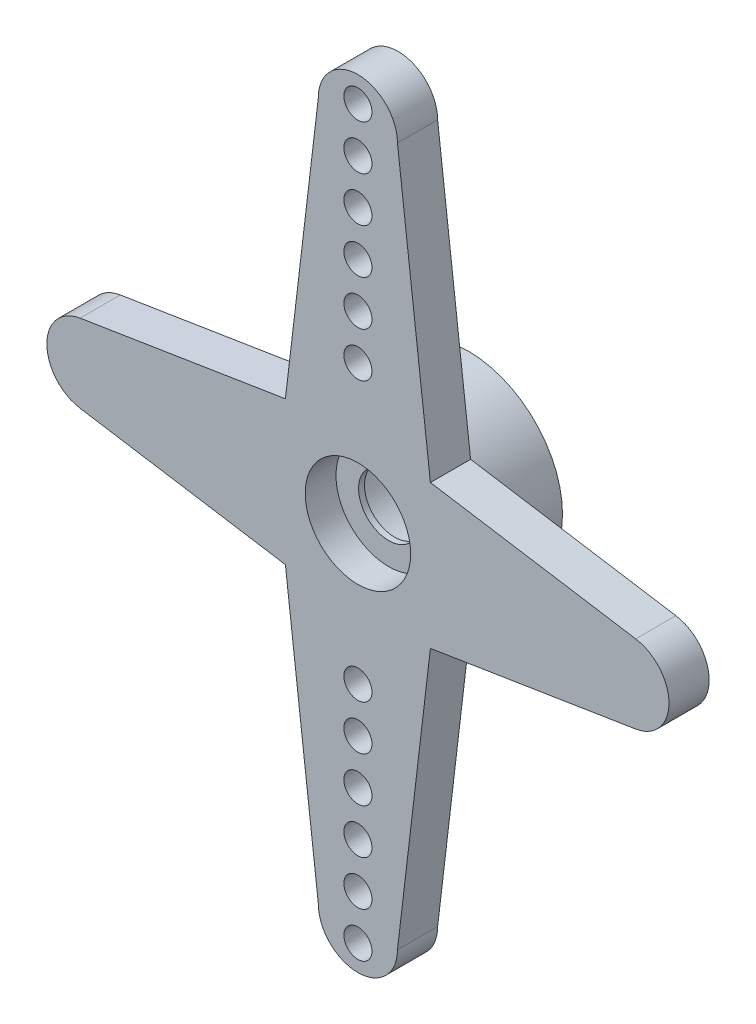
ISO-10303-21;
HEADER;
FILE_DESCRIPTION(('STEP AP214'),'2;1');
FILE_NAME('part.step','',(''),(''),'','','');
FILE_SCHEMA(('AUTOMOTIVE_DESIGN { 1 0 10303 214 1 1 1 1 }'));
ENDSEC;
DATA;
#1=APPLICATION_CONTEXT('core data for automotive mechanical design processes');
#2=APPLICATION_PROTOCOL_DEFINITION('international standard','automotive_design',2000,#1);
#3=PRODUCT_CONTEXT('',#1,'mechanical');
#4=PRODUCT('Part','Part','',(#3));
#5=PRODUCT_RELATED_PRODUCT_CATEGORY('part','',(#4));
#6=PRODUCT_DEFINITION_FORMATION('','',#4);
#7=PRODUCT_DEFINITION_CONTEXT('part definition',#1,'design');
#8=PRODUCT_DEFINITION('design','',#6,#7);
#9=PRODUCT_DEFINITION_SHAPE('','',#8);
#10=(LENGTH_UNIT() NAMED_UNIT(*) SI_UNIT(.MILLI.,.METRE.));
#11=(NAMED_UNIT(*) PLANE_ANGLE_UNIT() SI_UNIT($,.RADIAN.));
#12=(NAMED_UNIT(*) SI_UNIT($,.STERADIAN.) SOLID_ANGLE_UNIT());
#13=UNCERTAINTY_MEASURE_WITH_UNIT(LENGTH_MEASURE(1.E-05),#10,'distance_accuracy_value','');
#14=(GEOMETRIC_REPRESENTATION_CONTEXT(3) GLOBAL_UNCERTAINTY_ASSIGNED_CONTEXT((#13)) GLOBAL_UNIT_ASSIGNED_CONTEXT((#10,
#11,#12)) REPRESENTATION_CONTEXT('',''));
#15=CARTESIAN_POINT('',(0.,0.,0.));
#16=DIRECTION('',(0.,0.,1.));
#17=DIRECTION('',(1.,0.,0.));
#18=AXIS2_PLACEMENT_3D('',#15,#16,#17);
#19=CARTESIAN_POINT('',(-5.49999999999997,0.,-2.84196586235089));
#20=DIRECTION('',(0.,0.,-1.));
#21=DIRECTION('',(-1.,0.,0.));
#22=AXIS2_PLACEMENT_3D('',#19,#20,#21);
#23=CYLINDRICAL_SURFACE('',#22,3.5687);
#24=CARTESIAN_POINT('',(-5.49999999999997,0.,-7.03296586235089));
#25=DIRECTION('',(0.,0.,1.));
#26=DIRECTION('',(1.,0.,0.));
#27=AXIS2_PLACEMENT_3D('',#24,#25,#26);
#28=CIRCLE('',#27,3.5687);
#29=CARTESIAN_POINT('',(-1.93129999999997,0.,-7.03296586235089));
#30=VERTEX_POINT('',#29);
#31=EDGE_CURVE('E120',#30,#30,#28,.T.);
#32=ORIENTED_EDGE('',*,*,#31,.T.);
#33=EDGE_LOOP('',(#32));
#34=FACE_BOUND('',#33,.T.);
#35=CARTESIAN_POINT('',(-5.49999999999995,0.,-4.36596586235089));
#36=DIRECTION('',(0.,0.,-1.));
#37=DIRECTION('',(-1.,0.,0.));
#38=AXIS2_PLACEMENT_3D('',#35,#36,#37);
#39=CIRCLE('',#38,3.5687);
#40=CARTESIAN_POINT('',(-9.06869999999996,0.,-4.36596586235089));
#41=VERTEX_POINT('',#40);
#42=EDGE_CURVE('E200',#41,#41,#39,.T.);
#43=ORIENTED_EDGE('',*,*,#42,.T.);
#44=EDGE_LOOP('',(#43));
#45=FACE_BOUND('',#44,.T.);
#46=ADVANCED_FACE('F36',(#34,#45),#23,.T.);
#47=CARTESIAN_POINT('',(-3.99999999999996,-13.25,-4.36596586235089));
#48=DIRECTION('',(0.993018859815339,-0.117955686810959,0.));
#49=DIRECTION('',(0.117955686810959,0.993018859815339,0.));
#50=AXIS2_PLACEMENT_3D('',#47,#48,#49);
#51=PLANE('',#50);
#52=DIRECTION('',(0.117955686810959,0.993018859815339,0.));
#53=VECTOR('',#52,1.);
#54=CARTESIAN_POINT('',(-3.99999999999996,-13.25,-4.36596586235089));
#55=LINE('',#54,#53);
#56=CARTESIAN_POINT('',(-3.99999999999996,-13.25,-4.36596586235089));
#57=VERTEX_POINT('',#56);
#58=CARTESIAN_POINT('',(-2.7497342378757,-2.72454323621939,-4.36596586235089));
#59=VERTEX_POINT('',#58);
#60=EDGE_CURVE('E198',#57,#59,#55,.T.);
#61=ORIENTED_EDGE('',*,*,#60,.T.);
#62=DIRECTION('',(0.,0.,1.));
#63=VECTOR('',#62,1.);
#64=CARTESIAN_POINT('',(-2.7497342378757,-2.72454323621939,-4.36596586235089));
#65=LINE('',#64,#63);
#66=CARTESIAN_POINT('',(-2.7497342378757,-2.72454323621939,-2.84196586235089));
#67=VERTEX_POINT('',#66);
#68=EDGE_CURVE('E336',#59,#67,#65,.T.);
#69=ORIENTED_EDGE('',*,*,#68,.T.);
#70=DIRECTION('',(0.117955686810959,0.993018859815339,0.));
#71=VECTOR('',#70,1.);
#72=CARTESIAN_POINT('',(-3.99999999999996,-13.25,-2.84196586235089));
#73=LINE('',#72,#71);
#74=CARTESIAN_POINT('',(-3.99999999999996,-13.25,-2.84196586235089));
#75=VERTEX_POINT('',#74);
#76=EDGE_CURVE('E86',#75,#67,#73,.T.);
#77=ORIENTED_EDGE('',*,*,#76,.F.);
#78=DIRECTION('',(0.,0.,1.));
#79=VECTOR('',#78,1.);
#80=CARTESIAN_POINT('',(-3.99999999999996,-13.25,-4.36596586235089));
#81=LINE('',#80,#79);
#82=EDGE_CURVE('E94',#57,#75,#81,.T.);
#83=ORIENTED_EDGE('',*,*,#82,.F.);
#84=EDGE_LOOP('',(#61,#69,#77,#83));
#85=FACE_BOUND('',#84,.T.);
#86=ADVANCED_FACE('F386',(#85),#51,.T.);
#87=CARTESIAN_POINT('',(-3.99999999999996,13.25,-4.36596586235089));
#88=DIRECTION('',(-0.993018859815339,-0.117955686810959,0.));
#89=DIRECTION('',(0.117955686810959,-0.993018859815339,0.));
#90=AXIS2_PLACEMENT_3D('',#87,#88,#89);
#91=PLANE('',#90);
#92=DIRECTION('',(0.,0.,1.));
#93=VECTOR('',#92,1.);
#94=CARTESIAN_POINT('',(-2.7497342378757,2.72454323621939,-4.36596586235089));
#95=LINE('',#94,#93);
#96=CARTESIAN_POINT('',(-2.7497342378757,2.72454323621939,-4.36596586235089));
#97=VERTEX_POINT('',#96);
#98=CARTESIAN_POINT('',(-2.7497342378757,2.72454323621939,-2.84196586235089));
#99=VERTEX_POINT('',#98);
#100=EDGE_CURVE('E12',#97,#99,#95,.T.);
#101=ORIENTED_EDGE('',*,*,#100,.F.);
#102=DIRECTION('',(0.117955686810959,-0.993018859815339,0.));
#103=VECTOR('',#102,1.);
#104=CARTESIAN_POINT('',(-3.99999999999996,13.25,-4.36596586235089));
#105=LINE('',#104,#103);
#106=CARTESIAN_POINT('',(-3.99999999999996,13.25,-4.36596586235089));
#107=VERTEX_POINT('',#106);
#108=EDGE_CURVE('E165',#107,#97,#105,.T.);
#109=ORIENTED_EDGE('',*,*,#108,.F.);
#110=DIRECTION('',(0.,0.,1.));
#111=VECTOR('',#110,1.);
#112=CARTESIAN_POINT('',(-3.99999999999996,13.25,-4.36596586235089));
#113=LINE('',#112,#111);
#114=CARTESIAN_POINT('',(-3.99999999999996,13.25,-2.84196586235089));
#115=VERTEX_POINT('',#114);
#116=EDGE_CURVE('E159',#107,#115,#113,.T.);
#117=ORIENTED_EDGE('',*,*,#116,.T.);
#118=DIRECTION('',(0.117955686810959,-0.993018859815339,0.));
#119=VECTOR('',#118,1.);
#120=CARTESIAN_POINT('',(-3.99999999999996,13.25,-2.84196586235089));
#121=LINE('',#120,#119);
#122=EDGE_CURVE('E150',#115,#99,#121,.T.);
#123=ORIENTED_EDGE('',*,*,#122,.T.);
#124=EDGE_LOOP('',(#101,#109,#117,#123));
#125=FACE_BOUND('',#124,.T.);
#126=ADVANCED_FACE('F292',(#125),#91,.F.);
#127=CARTESIAN_POINT('',(-5.49999999999997,0.,-2.84196586235089));
#128=DIRECTION('',(0.,0.,-1.));
#129=DIRECTION('',(-1.,0.,0.));
#130=AXIS2_PLACEMENT_3D('',#127,#128,#129);
#131=CYLINDRICAL_SURFACE('',#130,2.);
#132=CARTESIAN_POINT('',(-5.49999999999997,0.,-7.03296586235089));
#133=DIRECTION('',(0.,0.,1.));
#134=DIRECTION('',(1.,0.,0.));
#135=AXIS2_PLACEMENT_3D('',#132,#133,#134);
#136=CIRCLE('',#135,2.);
#137=CARTESIAN_POINT('',(-3.49999999999996,0.,-7.03296586235089));
#138=VERTEX_POINT('',#137);
#139=EDGE_CURVE('E114',#138,#138,#136,.T.);
#140=ORIENTED_EDGE('',*,*,#139,.F.);
#141=EDGE_LOOP('',(#140));
#142=FACE_BOUND('',#141,.T.);
#143=CARTESIAN_POINT('',(-5.49999999999997,0.,-4.23296586235089));
#144=DIRECTION('',(0.,0.,1.));
#145=DIRECTION('',(1.,0.,0.));
#146=AXIS2_PLACEMENT_3D('',#143,#144,#145);
#147=CIRCLE('',#146,2.00000000000001);
#148=CARTESIAN_POINT('',(-3.49999999999996,0.,-4.23296586235089));
#149=VERTEX_POINT('',#148);
#150=EDGE_CURVE('E111',#149,#149,#147,.T.);
#151=ORIENTED_EDGE('',*,*,#150,.T.);
#152=EDGE_LOOP('',(#151));
#153=FACE_BOUND('',#152,.T.);
#154=ADVANCED_FACE('F401',(#142,#153),#131,.F.);
#155=CARTESIAN_POINT('',(-5.49999999999997,0.,-2.84196586235089));
#156=DIRECTION('',(0.,0.,1.));
#157=DIRECTION('',(1.,0.,0.));
#158=AXIS2_PLACEMENT_3D('',#155,#156,#157);
#159=PLANE('',#158);
#160=DIRECTION('',(0.987489905673695,-0.157682231695767,0.));
#161=VECTOR('',#160,1.);
#162=CARTESIAN_POINT('',(5.03652334754369,1.48123485851054,-2.84196586235089));
#163=LINE('',#162,#161);
#164=CARTESIAN_POINT('',(5.03652334754369,1.48123485851054,-2.84196586235089));
#165=VERTEX_POINT('',#164);
#166=EDGE_CURVE('E300',#99,#165,#163,.T.);
#167=ORIENTED_EDGE('',*,*,#166,.F.);
#168=ORIENTED_EDGE('',*,*,#122,.F.);
#169=CARTESIAN_POINT('',(-5.49999999999996,13.25,-2.84196586235089));
#170=DIRECTION('',(0.,0.,-1.));
#171=DIRECTION('',(1.,0.,0.));
#172=AXIS2_PLACEMENT_3D('',#169,#170,#171);
#173=CIRCLE('',#172,1.5);
#174=CARTESIAN_POINT('',(-6.99999999999996,13.25,-2.84196586235089));
#175=VERTEX_POINT('',#174);
#176=EDGE_CURVE('E149',#175,#115,#173,.T.);
#177=ORIENTED_EDGE('',*,*,#176,.F.);
#178=DIRECTION('',(0.117955686810956,0.993018859815339,0.));
#179=VECTOR('',#178,1.);
#180=CARTESIAN_POINT('',(-6.99999999999996,13.25,-2.84196586235089));
#181=LINE('',#180,#179);
#182=CARTESIAN_POINT('',(-8.25026576212421,2.72454323621939,-2.84196586235089));
#183=VERTEX_POINT('',#182);
#184=EDGE_CURVE('E136',#183,#175,#181,.T.);
#185=ORIENTED_EDGE('',*,*,#184,.F.);
#186=DIRECTION('',(-0.987489905673695,-0.157682231695767,0.));
#187=VECTOR('',#186,1.);
#188=CARTESIAN_POINT('',(-16.0365233475436,1.48123485851054,-2.84196586235089));
#189=LINE('',#188,#187);
#190=CARTESIAN_POINT('',(-16.0365233475436,1.48123485851054,-2.84196586235089));
#191=VERTEX_POINT('',#190);
#192=EDGE_CURVE('E145',#183,#191,#189,.T.);
#193=ORIENTED_EDGE('',*,*,#192,.T.);
#194=CARTESIAN_POINT('',(-15.8,0.,-2.84196586235089));
#195=DIRECTION('',(0.,0.,1.));
#196=DIRECTION('',(1.,0.,0.));
#197=AXIS2_PLACEMENT_3D('',#194,#195,#196);
#198=CIRCLE('',#197,1.5);
#199=CARTESIAN_POINT('',(-16.0365233475436,-1.48123485851054,-2.84196586235089));
#200=VERTEX_POINT('',#199);
#201=EDGE_CURVE('E335',#191,#200,#198,.T.);
#202=ORIENTED_EDGE('',*,*,#201,.T.);
#203=DIRECTION('',(0.987489905673695,-0.157682231695767,0.));
#204=VECTOR('',#203,1.);
#205=CARTESIAN_POINT('',(-16.0365233475436,-1.48123485851054,-2.84196586235089));
#206=LINE('',#205,#204);
#207=CARTESIAN_POINT('',(-8.25026576212421,-2.72454323621939,-2.84196586235089));
#208=VERTEX_POINT('',#207);
#209=EDGE_CURVE('E84',#200,#208,#206,.T.);
#210=ORIENTED_EDGE('',*,*,#209,.T.);
#211=DIRECTION('',(0.117955686810956,-0.993018859815339,0.));
#212=VECTOR('',#211,1.);
#213=CARTESIAN_POINT('',(-6.99999999999996,-13.25,-2.84196586235089));
#214=LINE('',#213,#212);
#215=CARTESIAN_POINT('',(-6.99999999999996,-13.25,-2.84196586235089));
#216=VERTEX_POINT('',#215);
#217=EDGE_CURVE('E74',#208,#216,#214,.T.);
#218=ORIENTED_EDGE('',*,*,#217,.T.);
#219=CARTESIAN_POINT('',(-5.49999999999996,-13.25,-2.84196586235089));
#220=DIRECTION('',(0.,0.,1.));
#221=DIRECTION('',(1.,0.,0.));
#222=AXIS2_PLACEMENT_3D('',#219,#220,#221);
#223=CIRCLE('',#222,1.5);
#224=EDGE_CURVE('E80',#216,#75,#223,.T.);
#225=ORIENTED_EDGE('',*,*,#224,.T.);
#226=ORIENTED_EDGE('',*,*,#76,.T.);
#227=DIRECTION('',(-0.987489905673695,-0.157682231695767,0.));
#228=VECTOR('',#227,1.);
#229=CARTESIAN_POINT('',(5.03652334754369,-1.48123485851054,-2.84196586235089));
#230=LINE('',#229,#228);
#231=CARTESIAN_POINT('',(5.03652334754369,-1.48123485851054,-2.84196586235089));
#232=VERTEX_POINT('',#231);
#233=EDGE_CURVE('E348',#232,#67,#230,.T.);
#234=ORIENTED_EDGE('',*,*,#233,.F.);
#235=CARTESIAN_POINT('',(4.80000000000004,0.,-2.84196586235089));
#236=DIRECTION('',(0.,0.,-1.));
#237=DIRECTION('',(-1.,0.,0.));
#238=AXIS2_PLACEMENT_3D('',#235,#236,#237);
#239=CIRCLE('',#238,1.5);
#240=EDGE_CURVE('E353',#165,#232,#239,.T.);
#241=ORIENTED_EDGE('',*,*,#240,.F.);
#242=EDGE_LOOP('',(#167,#168,#177,#185,#193,#202,#210,#218,#225,#226,#234,#241));
#243=FACE_BOUND('',#242,.T.);
#244=CARTESIAN_POINT('',(-5.49999999999997,0.,-2.84196586235089));
#245=DIRECTION('',(0.,0.,1.));
#246=DIRECTION('',(1.,0.,0.));
#247=AXIS2_PLACEMENT_3D('',#244,#245,#246);
#248=CIRCLE('',#247,2.);
#249=CARTESIAN_POINT('',(-3.49999999999996,0.,-2.84196586235089));
#250=VERTEX_POINT('',#249);
#251=EDGE_CURVE('E117',#250,#250,#248,.T.);
#252=ORIENTED_EDGE('',*,*,#251,.F.);
#253=EDGE_LOOP('',(#252));
#254=FACE_BOUND('',#253,.T.);
#255=CARTESIAN_POINT('',(-5.49999999999997,-5.2744,-2.84196586235089));
#256=DIRECTION('',(0.,0.,1.));
#257=DIRECTION('',(1.,0.,0.));
#258=AXIS2_PLACEMENT_3D('',#255,#256,#257);
#259=CIRCLE('',#258,0.533399999999999);
#260=CARTESIAN_POINT('',(-4.96659999999997,-5.2744,-2.84196586235089));
#261=VERTEX_POINT('',#260);
#262=EDGE_CURVE('E162',#261,#261,#259,.T.);
#263=ORIENTED_EDGE('',*,*,#262,.F.);
#264=EDGE_LOOP('',(#263));
#265=FACE_BOUND('',#264,.T.);
#266=CARTESIAN_POINT('',(-5.49999999999997,-6.9762,-2.84196586235089));
#267=DIRECTION('',(0.,0.,1.));
#268=DIRECTION('',(1.,0.,0.));
#269=AXIS2_PLACEMENT_3D('',#266,#267,#268);
#270=CIRCLE('',#269,0.533399999999999);
#271=CARTESIAN_POINT('',(-4.96659999999997,-6.9762,-2.84196586235089));
#272=VERTEX_POINT('',#271);
#273=EDGE_CURVE('E169',#272,#272,#270,.T.);
#274=ORIENTED_EDGE('',*,*,#273,.F.);
#275=EDGE_LOOP('',(#274));
#276=FACE_BOUND('',#275,.T.);
#277=CARTESIAN_POINT('',(-5.49999999999997,-8.678,-2.84196586235089));
#278=DIRECTION('',(0.,0.,1.));
#279=DIRECTION('',(1.,0.,0.));
#280=AXIS2_PLACEMENT_3D('',#277,#278,#279);
#281=CIRCLE('',#280,0.5334);
#282=CARTESIAN_POINT('',(-4.96659999999997,-8.678,-2.84196586235089));
#283=VERTEX_POINT('',#282);
#284=EDGE_CURVE('E175',#283,#283,#281,.T.);
#285=ORIENTED_EDGE('',*,*,#284,.F.);
#286=EDGE_LOOP('',(#285));
#287=FACE_BOUND('',#286,.T.);
#288=CARTESIAN_POINT('',(-5.49999999999997,-10.3798,-2.84196586235089));
#289=DIRECTION('',(0.,0.,1.));
#290=DIRECTION('',(1.,0.,0.));
#291=AXIS2_PLACEMENT_3D('',#288,#289,#290);
#292=CIRCLE('',#291,0.5334);
#293=CARTESIAN_POINT('',(-4.96659999999997,-10.3798,-2.84196586235089));
#294=VERTEX_POINT('',#293);
#295=EDGE_CURVE('E181',#294,#294,#292,.T.);
#296=ORIENTED_EDGE('',*,*,#295,.F.);
#297=EDGE_LOOP('',(#296));
#298=FACE_BOUND('',#297,.T.);
#299=CARTESIAN_POINT('',(-5.49999999999996,-12.0816,-2.84196586235089));
#300=DIRECTION('',(0.,0.,1.));
#301=DIRECTION('',(1.,0.,0.));
#302=AXIS2_PLACEMENT_3D('',#299,#300,#301);
#303=CIRCLE('',#302,0.5334);
#304=CARTESIAN_POINT('',(-4.96659999999996,-12.0816,-2.84196586235089));
#305=VERTEX_POINT('',#304);
#306=EDGE_CURVE('E187',#305,#305,#303,.T.);
#307=ORIENTED_EDGE('',*,*,#306,.F.);
#308=EDGE_LOOP('',(#307));
#309=FACE_BOUND('',#308,.T.);
#310=CARTESIAN_POINT('',(-5.49999999999996,-13.7834,-2.84196586235089));
#311=DIRECTION('',(0.,0.,1.));
#312=DIRECTION('',(1.,0.,0.));
#313=AXIS2_PLACEMENT_3D('',#310,#311,#312);
#314=CIRCLE('',#313,0.5334);
#315=CARTESIAN_POINT('',(-4.96659999999996,-13.7834,-2.84196586235089));
#316=VERTEX_POINT('',#315);
#317=EDGE_CURVE('E102',#316,#316,#314,.T.);
#318=ORIENTED_EDGE('',*,*,#317,.F.);
#319=EDGE_LOOP('',(#318));
#320=FACE_BOUND('',#319,.T.);
#321=CARTESIAN_POINT('',(-5.49999999999997,6.9762,-2.84196586235089));
#322=DIRECTION('',(0.,0.,-1.));
#323=DIRECTION('',(1.,0.,0.));
#324=AXIS2_PLACEMENT_3D('',#321,#322,#323);
#325=CIRCLE('',#324,0.533399999999999);
#326=CARTESIAN_POINT('',(-4.96659999999997,6.9762,-2.84196586235089));
#327=VERTEX_POINT('',#326);
#328=EDGE_CURVE('E245',#327,#327,#325,.T.);
#329=ORIENTED_EDGE('',*,*,#328,.T.);
#330=EDGE_LOOP('',(#329));
#331=FACE_BOUND('',#330,.T.);
#332=CARTESIAN_POINT('',(-5.49999999999997,10.3798,-2.84196586235089));
#333=DIRECTION('',(0.,0.,-1.));
#334=DIRECTION('',(1.,0.,0.));
#335=AXIS2_PLACEMENT_3D('',#332,#333,#334);
#336=CIRCLE('',#335,0.5334);
#337=CARTESIAN_POINT('',(-4.96659999999997,10.3798,-2.84196586235089));
#338=VERTEX_POINT('',#337);
#339=EDGE_CURVE('E259',#338,#338,#336,.T.);
#340=ORIENTED_EDGE('',*,*,#339,.T.);
#341=EDGE_LOOP('',(#340));
#342=FACE_BOUND('',#341,.T.);
#343=CARTESIAN_POINT('',(-5.49999999999996,13.7834,-2.84196586235089));
#344=DIRECTION('',(0.,0.,-1.));
#345=DIRECTION('',(1.,0.,0.));
#346=AXIS2_PLACEMENT_3D('',#343,#344,#345);
#347=CIRCLE('',#346,0.5334);
#348=CARTESIAN_POINT('',(-4.96659999999996,13.7834,-2.84196586235089));
#349=VERTEX_POINT('',#348);
#350=EDGE_CURVE('E267',#349,#349,#347,.T.);
#351=ORIENTED_EDGE('',*,*,#350,.T.);
#352=EDGE_LOOP('',(#351));
#353=FACE_BOUND('',#352,.T.);
#354=CARTESIAN_POINT('',(-5.49999999999996,12.0816,-2.84196586235089));
#355=DIRECTION('',(0.,0.,-1.));
#356=DIRECTION('',(1.,0.,0.));
#357=AXIS2_PLACEMENT_3D('',#354,#355,#356);
#358=CIRCLE('',#357,0.5334);
#359=CARTESIAN_POINT('',(-4.96659999999996,12.0816,-2.84196586235089));
#360=VERTEX_POINT('',#359);
#361=EDGE_CURVE('E263',#360,#360,#358,.T.);
#362=ORIENTED_EDGE('',*,*,#361,.T.);
#363=EDGE_LOOP('',(#362));
#364=FACE_BOUND('',#363,.T.);
#365=CARTESIAN_POINT('',(-5.49999999999997,8.678,-2.84196586235089));
#366=DIRECTION('',(0.,0.,-1.));
#367=DIRECTION('',(1.,0.,0.));
#368=AXIS2_PLACEMENT_3D('',#365,#366,#367);
#369=CIRCLE('',#368,0.5334);
#370=CARTESIAN_POINT('',(-4.96659999999997,8.678,-2.84196586235089));
#371=VERTEX_POINT('',#370);
#372=EDGE_CURVE('E256',#371,#371,#369,.T.);
#373=ORIENTED_EDGE('',*,*,#372,.T.);
#374=EDGE_LOOP('',(#373));
#375=FACE_BOUND('',#374,.T.);
#376=CARTESIAN_POINT('',(-5.49999999999997,5.2744,-2.84196586235089));
#377=DIRECTION('',(0.,0.,-1.));
#378=DIRECTION('',(1.,0.,0.));
#379=AXIS2_PLACEMENT_3D('',#376,#377,#378);
#380=CIRCLE('',#379,0.533399999999999);
#381=CARTESIAN_POINT('',(-4.96659999999997,5.2744,-2.84196586235089));
#382=VERTEX_POINT('',#381);
#383=EDGE_CURVE('E246',#382,#382,#380,.T.);
#384=ORIENTED_EDGE('',*,*,#383,.T.);
#385=EDGE_LOOP('',(#384));
#386=FACE_BOUND('',#385,.T.);
#387=ADVANCED_FACE('F76',(#243,#254,#265,#276,#287,#298,#309,#320,#331,#342,#353,#364,#375,
#386),#159,.T.);
#388=CARTESIAN_POINT('',(-5.49999999999997,0.,-7.03296586235089));
#389=DIRECTION('',(0.,0.,1.));
#390=DIRECTION('',(1.,0.,0.));
#391=AXIS2_PLACEMENT_3D('',#388,#389,#390);
#392=PLANE('',#391);
#393=ORIENTED_EDGE('',*,*,#31,.F.);
#394=EDGE_LOOP('',(#393));
#395=FACE_BOUND('',#394,.T.);
#396=ORIENTED_EDGE('',*,*,#139,.T.);
#397=EDGE_LOOP('',(#396));
#398=FACE_BOUND('',#397,.T.);
#399=ADVANCED_FACE('F395',(#395,#398),#392,.F.);
#400=CARTESIAN_POINT('',(-5.49999999999997,0.,-4.01036586235089));
#401=DIRECTION('',(0.,0.,1.));
#402=DIRECTION('',(1.,0.,0.));
#403=AXIS2_PLACEMENT_3D('',#400,#401,#402);
#404=CIRCLE('',#403,2.);
#405=CARTESIAN_POINT('',(-3.49999999999996,0.,-4.01036586235089));
#406=VERTEX_POINT('',#405);
#407=EDGE_CURVE('E125',#406,#406,#404,.T.);
#408=ORIENTED_EDGE('',*,*,#407,.F.);
#409=EDGE_LOOP('',(#408));
#410=FACE_BOUND('',#409,.T.);
#411=ORIENTED_EDGE('',*,*,#251,.T.);
#412=EDGE_LOOP('',(#411));
#413=FACE_BOUND('',#412,.T.);
#414=ADVANCED_FACE('F398',(#410,#413),#131,.F.);
#415=CARTESIAN_POINT('',(-5.49999999999997,0.,-4.23296586235089));
#416=DIRECTION('',(0.,0.,1.));
#417=DIRECTION('',(1.,0.,0.));
#418=AXIS2_PLACEMENT_3D('',#415,#416,#417);
#419=PLANE('',#418);
#420=ORIENTED_EDGE('',*,*,#150,.F.);
#421=EDGE_LOOP('',(#420));
#422=FACE_BOUND('',#421,.T.);
#423=CARTESIAN_POINT('',(-5.49999999999997,0.,-4.23296586235089));
#424=DIRECTION('',(0.,0.,1.));
#425=DIRECTION('',(1.,0.,0.));
#426=AXIS2_PLACEMENT_3D('',#423,#424,#425);
#427=CIRCLE('',#426,1.14300000000001);
#428=CARTESIAN_POINT('',(-4.35699999999996,0.,-4.23296586235089));
#429=VERTEX_POINT('',#428);
#430=EDGE_CURVE('E108',#429,#429,#427,.T.);
#431=ORIENTED_EDGE('',*,*,#430,.T.);
#432=EDGE_LOOP('',(#431));
#433=FACE_BOUND('',#432,.T.);
#434=ADVANCED_FACE('F407',(#422,#433),#419,.F.);
#435=CARTESIAN_POINT('',(-5.49999999999997,0.,2.81488838714151));
#436=DIRECTION('',(0.,0.,-1.));
#437=DIRECTION('',(-1.,0.,0.));
#438=AXIS2_PLACEMENT_3D('',#435,#436,#437);
#439=CYLINDRICAL_SURFACE('',#438,1.14300000000001);
#440=ORIENTED_EDGE('',*,*,#430,.F.);
#441=EDGE_LOOP('',(#440));
#442=FACE_BOUND('',#441,.T.);
#443=CARTESIAN_POINT('',(-5.49999999999997,0.,-4.01036586235089));
#444=DIRECTION('',(0.,0.,1.));
#445=DIRECTION('',(1.,0.,0.));
#446=AXIS2_PLACEMENT_3D('',#443,#444,#445);
#447=CIRCLE('',#446,1.14300000000001);
#448=CARTESIAN_POINT('',(-4.35699999999996,0.,-4.01036586235089));
#449=VERTEX_POINT('',#448);
#450=EDGE_CURVE('E93',#449,#449,#447,.T.);
#451=ORIENTED_EDGE('',*,*,#450,.T.);
#452=EDGE_LOOP('',(#451));
#453=FACE_BOUND('',#452,.T.);
#454=ADVANCED_FACE('F410',(#442,#453),#439,.F.);
#455=CARTESIAN_POINT('',(-5.49999999999997,0.,-4.01036586235089));
#456=DIRECTION('',(0.,0.,1.));
#457=DIRECTION('',(1.,0.,0.));
#458=AXIS2_PLACEMENT_3D('',#455,#456,#457);
#459=PLANE('',#458);
#460=ORIENTED_EDGE('',*,*,#450,.F.);
#461=EDGE_LOOP('',(#460));
#462=FACE_BOUND('',#461,.T.);
#463=ORIENTED_EDGE('',*,*,#407,.T.);
#464=EDGE_LOOP('',(#463));
#465=FACE_BOUND('',#464,.T.);
#466=ADVANCED_FACE('F416',(#462,#465),#459,.T.);
#467=CARTESIAN_POINT('',(-5.49999999999996,-13.25,-4.36596586235089));
#468=DIRECTION('',(0.,0.,1.));
#469=DIRECTION('',(1.,0.,0.));
#470=AXIS2_PLACEMENT_3D('',#467,#468,#469);
#471=CYLINDRICAL_SURFACE('',#470,1.5);
#472=ORIENTED_EDGE('',*,*,#224,.F.);
#473=DIRECTION('',(0.,0.,1.));
#474=VECTOR('',#473,1.);
#475=CARTESIAN_POINT('',(-6.99999999999996,-13.25,-4.36596586235089));
#476=LINE('',#475,#474);
#477=CARTESIAN_POINT('',(-6.99999999999996,-13.25,-4.36596586235089));
#478=VERTEX_POINT('',#477);
#479=EDGE_CURVE('E88',#478,#216,#476,.T.);
#480=ORIENTED_EDGE('',*,*,#479,.F.);
#481=CARTESIAN_POINT('',(-5.49999999999996,-13.25,-4.36596586235089));
#482=DIRECTION('',(0.,0.,1.));
#483=DIRECTION('',(1.,0.,0.));
#484=AXIS2_PLACEMENT_3D('',#481,#482,#483);
#485=CIRCLE('',#484,1.5);
#486=EDGE_CURVE('E85',#478,#57,#485,.T.);
#487=ORIENTED_EDGE('',*,*,#486,.T.);
#488=ORIENTED_EDGE('',*,*,#82,.T.);
#489=EDGE_LOOP('',(#472,#480,#487,#488));
#490=FACE_BOUND('',#489,.T.);
#491=ADVANCED_FACE('F96',(#490),#471,.T.);
#492=CARTESIAN_POINT('',(-6.99999999999996,-13.25,-4.36596586235089));
#493=DIRECTION('',(-0.993018859815339,-0.117955686810956,0.));
#494=DIRECTION('',(0.117955686810956,-0.993018859815339,0.));
#495=AXIS2_PLACEMENT_3D('',#492,#493,#494);
#496=PLANE('',#495);
#497=DIRECTION('',(0.,0.,1.));
#498=VECTOR('',#497,1.);
#499=CARTESIAN_POINT('',(-8.2502657621242,-2.72454323621939,-4.36596586235089));
#500=LINE('',#499,#498);
#501=CARTESIAN_POINT('',(-8.2502657621242,-2.72454323621939,-4.36596586235089));
#502=VERTEX_POINT('',#501);
#503=EDGE_CURVE('E251',#502,#208,#500,.T.);
#504=ORIENTED_EDGE('',*,*,#503,.F.);
#505=DIRECTION('',(0.117955686810956,-0.993018859815339,0.));
#506=VECTOR('',#505,1.);
#507=CARTESIAN_POINT('',(-6.99999999999996,-13.25,-4.36596586235089));
#508=LINE('',#507,#506);
#509=EDGE_CURVE('E59',#502,#478,#508,.T.);
#510=ORIENTED_EDGE('',*,*,#509,.T.);
#511=ORIENTED_EDGE('',*,*,#479,.T.);
#512=ORIENTED_EDGE('',*,*,#217,.F.);
#513=EDGE_LOOP('',(#504,#510,#511,#512));
#514=FACE_BOUND('',#513,.T.);
#515=ADVANCED_FACE('F89',(#514),#496,.T.);
#516=CARTESIAN_POINT('',(-5.49999999999996,-13.25,-4.36596586235089));
#517=DIRECTION('',(0.,0.,1.));
#518=DIRECTION('',(1.,0.,0.));
#519=AXIS2_PLACEMENT_3D('',#516,#517,#518);
#520=PLANE('',#519);
#521=DIRECTION('',(0.987489905673695,0.157682231695767,0.));
#522=VECTOR('',#521,1.);
#523=CARTESIAN_POINT('',(5.03652334754369,-1.48123485851054,-4.36596586235089));
#524=LINE('',#523,#522);
#525=CARTESIAN_POINT('',(5.03652334754369,-1.48123485851054,-4.36596586235089));
#526=VERTEX_POINT('',#525);
#527=EDGE_CURVE('E343',#59,#526,#524,.T.);
#528=ORIENTED_EDGE('',*,*,#527,.F.);
#529=ORIENTED_EDGE('',*,*,#60,.F.);
#530=ORIENTED_EDGE('',*,*,#486,.F.);
#531=ORIENTED_EDGE('',*,*,#509,.F.);
#532=DIRECTION('',(-0.987489905673695,0.157682231695767,0.));
#533=VECTOR('',#532,1.);
#534=CARTESIAN_POINT('',(-16.0365233475436,-1.48123485851054,-4.36596586235089));
#535=LINE('',#534,#533);
#536=CARTESIAN_POINT('',(-16.0365233475436,-1.48123485851054,-4.36596586235089));
#537=VERTEX_POINT('',#536);
#538=EDGE_CURVE('E324',#502,#537,#535,.T.);
#539=ORIENTED_EDGE('',*,*,#538,.T.);
#540=CARTESIAN_POINT('',(-15.8,0.,-4.36596586235089));
#541=DIRECTION('',(0.,0.,1.));
#542=DIRECTION('',(1.,0.,0.));
#543=AXIS2_PLACEMENT_3D('',#540,#541,#542);
#544=CIRCLE('',#543,1.5);
#545=CARTESIAN_POINT('',(-16.0365233475436,1.48123485851054,-4.36596586235089));
#546=VERTEX_POINT('',#545);
#547=EDGE_CURVE('E325',#537,#546,#544,.F.);
#548=ORIENTED_EDGE('',*,*,#547,.T.);
#549=DIRECTION('',(0.987489905673695,0.157682231695767,0.));
#550=VECTOR('',#549,1.);
#551=CARTESIAN_POINT('',(-16.0365233475436,1.48123485851054,-4.36596586235089));
#552=LINE('',#551,#550);
#553=CARTESIAN_POINT('',(-8.2502657621242,2.72454323621939,-4.36596586235089));
#554=VERTEX_POINT('',#553);
#555=EDGE_CURVE('E50',#546,#554,#552,.T.);
#556=ORIENTED_EDGE('',*,*,#555,.T.);
#557=DIRECTION('',(0.117955686810956,0.993018859815339,0.));
#558=VECTOR('',#557,1.);
#559=CARTESIAN_POINT('',(-6.99999999999996,13.25,-4.36596586235089));
#560=LINE('',#559,#558);
#561=CARTESIAN_POINT('',(-6.99999999999996,13.25,-4.36596586235089));
#562=VERTEX_POINT('',#561);
#563=EDGE_CURVE('E138',#554,#562,#560,.T.);
#564=ORIENTED_EDGE('',*,*,#563,.T.);
#565=CARTESIAN_POINT('',(-5.49999999999996,13.25,-4.36596586235089));
#566=DIRECTION('',(0.,0.,-1.));
#567=DIRECTION('',(1.,0.,0.));
#568=AXIS2_PLACEMENT_3D('',#565,#566,#567);
#569=CIRCLE('',#568,1.5);
#570=EDGE_CURVE('E153',#562,#107,#569,.T.);
#571=ORIENTED_EDGE('',*,*,#570,.T.);
#572=ORIENTED_EDGE('',*,*,#108,.T.);
#573=DIRECTION('',(-0.987489905673695,0.157682231695767,0.));
#574=VECTOR('',#573,1.);
#575=CARTESIAN_POINT('',(5.03652334754369,1.48123485851054,-4.36596586235089));
#576=LINE('',#575,#574);
#577=CARTESIAN_POINT('',(5.03652334754369,1.48123485851054,-4.36596586235089));
#578=VERTEX_POINT('',#577);
#579=EDGE_CURVE('E283',#578,#97,#576,.T.);
#580=ORIENTED_EDGE('',*,*,#579,.F.);
#581=CARTESIAN_POINT('',(4.80000000000004,0.,-4.36596586235089));
#582=DIRECTION('',(0.,0.,1.));
#583=DIRECTION('',(1.,0.,0.));
#584=AXIS2_PLACEMENT_3D('',#581,#582,#583);
#585=CIRCLE('',#584,1.5);
#586=EDGE_CURVE('E341',#526,#578,#585,.T.);
#587=ORIENTED_EDGE('',*,*,#586,.F.);
#588=EDGE_LOOP('',(#528,#529,#530,#531,#539,#548,#556,#564,#571,#572,#580,#587));
#589=FACE_BOUND('',#588,.T.);
#590=ORIENTED_EDGE('',*,*,#42,.F.);
#591=EDGE_LOOP('',(#590));
#592=FACE_BOUND('',#591,.T.);
#593=CARTESIAN_POINT('',(-5.49999999999997,-5.2744,-4.36596586235089));
#594=DIRECTION('',(0.,0.,1.));
#595=DIRECTION('',(1.,0.,0.));
#596=AXIS2_PLACEMENT_3D('',#593,#594,#595);
#597=CIRCLE('',#596,0.533399999999999);
#598=CARTESIAN_POINT('',(-4.96659999999997,-5.2744,-4.36596586235089));
#599=VERTEX_POINT('',#598);
#600=EDGE_CURVE('E166',#599,#599,#597,.T.);
#601=ORIENTED_EDGE('',*,*,#600,.T.);
#602=EDGE_LOOP('',(#601));
#603=FACE_BOUND('',#602,.T.);
#604=CARTESIAN_POINT('',(-5.49999999999997,-6.9762,-4.36596586235089));
#605=DIRECTION('',(0.,0.,1.));
#606=DIRECTION('',(1.,0.,0.));
#607=AXIS2_PLACEMENT_3D('',#604,#605,#606);
#608=CIRCLE('',#607,0.533399999999999);
#609=CARTESIAN_POINT('',(-4.96659999999997,-6.9762,-4.36596586235089));
#610=VERTEX_POINT('',#609);
#611=EDGE_CURVE('E172',#610,#610,#608,.T.);
#612=ORIENTED_EDGE('',*,*,#611,.T.);
#613=EDGE_LOOP('',(#612));
#614=FACE_BOUND('',#613,.T.);
#615=CARTESIAN_POINT('',(-5.49999999999997,-8.678,-4.36596586235089));
#616=DIRECTION('',(0.,0.,1.));
#617=DIRECTION('',(1.,0.,0.));
#618=AXIS2_PLACEMENT_3D('',#615,#616,#617);
#619=CIRCLE('',#618,0.5334);
#620=CARTESIAN_POINT('',(-4.96659999999997,-8.678,-4.36596586235089));
#621=VERTEX_POINT('',#620);
#622=EDGE_CURVE('E178',#621,#621,#619,.T.);
#623=ORIENTED_EDGE('',*,*,#622,.T.);
#624=EDGE_LOOP('',(#623));
#625=FACE_BOUND('',#624,.T.);
#626=CARTESIAN_POINT('',(-5.49999999999997,-10.3798,-4.36596586235089));
#627=DIRECTION('',(0.,0.,1.));
#628=DIRECTION('',(1.,0.,0.));
#629=AXIS2_PLACEMENT_3D('',#626,#627,#628);
#630=CIRCLE('',#629,0.5334);
#631=CARTESIAN_POINT('',(-4.96659999999997,-10.3798,-4.36596586235089));
#632=VERTEX_POINT('',#631);
#633=EDGE_CURVE('E184',#632,#632,#630,.T.);
#634=ORIENTED_EDGE('',*,*,#633,.T.);
#635=EDGE_LOOP('',(#634));
#636=FACE_BOUND('',#635,.T.);
#637=CARTESIAN_POINT('',(-5.49999999999996,-12.0816,-4.36596586235089));
#638=DIRECTION('',(0.,0.,1.));
#639=DIRECTION('',(1.,0.,0.));
#640=AXIS2_PLACEMENT_3D('',#637,#638,#639);
#641=CIRCLE('',#640,0.5334);
#642=CARTESIAN_POINT('',(-4.96659999999996,-12.0816,-4.36596586235089));
#643=VERTEX_POINT('',#642);
#644=EDGE_CURVE('E190',#643,#643,#641,.T.);
#645=ORIENTED_EDGE('',*,*,#644,.T.);
#646=EDGE_LOOP('',(#645));
#647=FACE_BOUND('',#646,.T.);
#648=CARTESIAN_POINT('',(-5.49999999999996,-13.7834,-4.36596586235089));
#649=DIRECTION('',(0.,0.,1.));
#650=DIRECTION('',(1.,0.,0.));
#651=AXIS2_PLACEMENT_3D('',#648,#649,#650);
#652=CIRCLE('',#651,0.5334);
#653=CARTESIAN_POINT('',(-4.96659999999996,-13.7834,-4.36596586235089));
#654=VERTEX_POINT('',#653);
#655=EDGE_CURVE('E98',#654,#654,#652,.T.);
#656=ORIENTED_EDGE('',*,*,#655,.T.);
#657=EDGE_LOOP('',(#656));
#658=FACE_BOUND('',#657,.T.);
#659=CARTESIAN_POINT('',(-5.49999999999996,13.7834,-4.36596586235089));
#660=DIRECTION('',(0.,0.,-1.));
#661=DIRECTION('',(1.,0.,0.));
#662=AXIS2_PLACEMENT_3D('',#659,#660,#661);
#663=CIRCLE('',#662,0.5334);
#664=CARTESIAN_POINT('',(-4.96659999999996,13.7834,-4.36596586235089));
#665=VERTEX_POINT('',#664);
#666=EDGE_CURVE('E155',#665,#665,#663,.T.);
#667=ORIENTED_EDGE('',*,*,#666,.F.);
#668=EDGE_LOOP('',(#667));
#669=FACE_BOUND('',#668,.T.);
#670=CARTESIAN_POINT('',(-5.49999999999996,12.0816,-4.36596586235089));
#671=DIRECTION('',(0.,0.,-1.));
#672=DIRECTION('',(1.,0.,0.));
#673=AXIS2_PLACEMENT_3D('',#670,#671,#672);
#674=CIRCLE('',#673,0.5334);
#675=CARTESIAN_POINT('',(-4.96659999999996,12.0816,-4.36596586235089));
#676=VERTEX_POINT('',#675);
#677=EDGE_CURVE('E228',#676,#676,#674,.T.);
#678=ORIENTED_EDGE('',*,*,#677,.F.);
#679=EDGE_LOOP('',(#678));
#680=FACE_BOUND('',#679,.T.);
#681=CARTESIAN_POINT('',(-5.49999999999997,10.3798,-4.36596586235089));
#682=DIRECTION('',(0.,0.,-1.));
#683=DIRECTION('',(1.,0.,0.));
#684=AXIS2_PLACEMENT_3D('',#681,#682,#683);
#685=CIRCLE('',#684,0.5334);
#686=CARTESIAN_POINT('',(-4.96659999999997,10.3798,-4.36596586235089));
#687=VERTEX_POINT('',#686);
#688=EDGE_CURVE('E232',#687,#687,#685,.T.);
#689=ORIENTED_EDGE('',*,*,#688,.F.);
#690=EDGE_LOOP('',(#689));
#691=FACE_BOUND('',#690,.T.);
#692=CARTESIAN_POINT('',(-5.49999999999997,8.678,-4.36596586235089));
#693=DIRECTION('',(0.,0.,-1.));
#694=DIRECTION('',(1.,0.,0.));
#695=AXIS2_PLACEMENT_3D('',#692,#693,#694);
#696=CIRCLE('',#695,0.5334);
#697=CARTESIAN_POINT('',(-4.96659999999997,8.678,-4.36596586235089));
#698=VERTEX_POINT('',#697);
#699=EDGE_CURVE('E236',#698,#698,#696,.T.);
#700=ORIENTED_EDGE('',*,*,#699,.F.);
#701=EDGE_LOOP('',(#700));
#702=FACE_BOUND('',#701,.T.);
#703=CARTESIAN_POINT('',(-5.49999999999997,6.9762,-4.36596586235089));
#704=DIRECTION('',(0.,0.,-1.));
#705=DIRECTION('',(1.,0.,0.));
#706=AXIS2_PLACEMENT_3D('',#703,#704,#705);
#707=CIRCLE('',#706,0.533399999999999);
#708=CARTESIAN_POINT('',(-4.96659999999997,6.9762,-4.36596586235089));
#709=VERTEX_POINT('',#708);
#710=EDGE_CURVE('E240',#709,#709,#707,.T.);
#711=ORIENTED_EDGE('',*,*,#710,.F.);
#712=EDGE_LOOP('',(#711));
#713=FACE_BOUND('',#712,.T.);
#714=CARTESIAN_POINT('',(-5.49999999999997,5.2744,-4.36596586235089));
#715=DIRECTION('',(0.,0.,-1.));
#716=DIRECTION('',(1.,0.,0.));
#717=AXIS2_PLACEMENT_3D('',#714,#715,#716);
#718=CIRCLE('',#717,0.533399999999999);
#719=CARTESIAN_POINT('',(-4.96659999999997,5.2744,-4.36596586235089));
#720=VERTEX_POINT('',#719);
#721=EDGE_CURVE('E243',#720,#720,#718,.T.);
#722=ORIENTED_EDGE('',*,*,#721,.F.);
#723=EDGE_LOOP('',(#722));
#724=FACE_BOUND('',#723,.T.);
#725=ADVANCED_FACE('F205',(#589,#592,#603,#614,#625,#636,#647,#658,#669,#680,#691,#702,#713,
#724),#520,.F.);
#726=CARTESIAN_POINT('',(-5.49999999999996,-13.7834,-4.36596586235089));
#727=DIRECTION('',(0.,0.,1.));
#728=DIRECTION('',(1.,0.,0.));
#729=AXIS2_PLACEMENT_3D('',#726,#727,#728);
#730=CYLINDRICAL_SURFACE('',#729,0.5334);
#731=ORIENTED_EDGE('',*,*,#655,.F.);
#732=EDGE_LOOP('',(#731));
#733=FACE_BOUND('',#732,.T.);
#734=ORIENTED_EDGE('',*,*,#317,.T.);
#735=EDGE_LOOP('',(#734));
#736=FACE_BOUND('',#735,.T.);
#737=ADVANCED_FACE('F208',(#733,#736),#730,.F.);
#738=CARTESIAN_POINT('',(-5.49999999999996,-12.0816,-4.36596586235089));
#739=DIRECTION('',(0.,0.,1.));
#740=DIRECTION('',(1.,0.,0.));
#741=AXIS2_PLACEMENT_3D('',#738,#739,#740);
#742=CYLINDRICAL_SURFACE('',#741,0.5334);
#743=ORIENTED_EDGE('',*,*,#644,.F.);
#744=EDGE_LOOP('',(#743));
#745=FACE_BOUND('',#744,.T.);
#746=ORIENTED_EDGE('',*,*,#306,.T.);
#747=EDGE_LOOP('',(#746));
#748=FACE_BOUND('',#747,.T.);
#749=ADVANCED_FACE('F508',(#745,#748),#742,.F.);
#750=CARTESIAN_POINT('',(-5.49999999999997,-10.3798,-4.36596586235089));
#751=DIRECTION('',(0.,0.,1.));
#752=DIRECTION('',(1.,0.,0.));
#753=AXIS2_PLACEMENT_3D('',#750,#751,#752);
#754=CYLINDRICAL_SURFACE('',#753,0.5334);
#755=ORIENTED_EDGE('',*,*,#633,.F.);
#756=EDGE_LOOP('',(#755));
#757=FACE_BOUND('',#756,.T.);
#758=ORIENTED_EDGE('',*,*,#295,.T.);
#759=EDGE_LOOP('',(#758));
#760=FACE_BOUND('',#759,.T.);
#761=ADVANCED_FACE('F504',(#757,#760),#754,.F.);
#762=CARTESIAN_POINT('',(-5.49999999999997,-8.678,-4.36596586235089));
#763=DIRECTION('',(0.,0.,1.));
#764=DIRECTION('',(1.,0.,0.));
#765=AXIS2_PLACEMENT_3D('',#762,#763,#764);
#766=CYLINDRICAL_SURFACE('',#765,0.5334);
#767=ORIENTED_EDGE('',*,*,#622,.F.);
#768=EDGE_LOOP('',(#767));
#769=FACE_BOUND('',#768,.T.);
#770=ORIENTED_EDGE('',*,*,#284,.T.);
#771=EDGE_LOOP('',(#770));
#772=FACE_BOUND('',#771,.T.);
#773=ADVANCED_FACE('F500',(#769,#772),#766,.F.);
#774=CARTESIAN_POINT('',(-5.49999999999997,-6.9762,-4.36596586235089));
#775=DIRECTION('',(0.,0.,1.));
#776=DIRECTION('',(1.,0.,0.));
#777=AXIS2_PLACEMENT_3D('',#774,#775,#776);
#778=CYLINDRICAL_SURFACE('',#777,0.533399999999999);
#779=ORIENTED_EDGE('',*,*,#611,.F.);
#780=EDGE_LOOP('',(#779));
#781=FACE_BOUND('',#780,.T.);
#782=ORIENTED_EDGE('',*,*,#273,.T.);
#783=EDGE_LOOP('',(#782));
#784=FACE_BOUND('',#783,.T.);
#785=ADVANCED_FACE('F496',(#781,#784),#778,.F.);
#786=CARTESIAN_POINT('',(-5.49999999999997,-5.2744,-4.36596586235089));
#787=DIRECTION('',(0.,0.,1.));
#788=DIRECTION('',(1.,0.,0.));
#789=AXIS2_PLACEMENT_3D('',#786,#787,#788);
#790=CYLINDRICAL_SURFACE('',#789,0.533399999999999);
#791=ORIENTED_EDGE('',*,*,#600,.F.);
#792=EDGE_LOOP('',(#791));
#793=FACE_BOUND('',#792,.T.);
#794=ORIENTED_EDGE('',*,*,#262,.T.);
#795=EDGE_LOOP('',(#794));
#796=FACE_BOUND('',#795,.T.);
#797=ADVANCED_FACE('F492',(#793,#796),#790,.F.);
#798=CARTESIAN_POINT('',(-5.49999999999996,13.25,-4.36596586235089));
#799=DIRECTION('',(0.,0.,1.));
#800=DIRECTION('',(1.,0.,0.));
#801=AXIS2_PLACEMENT_3D('',#798,#799,#800);
#802=CYLINDRICAL_SURFACE('',#801,1.5);
#803=ORIENTED_EDGE('',*,*,#176,.T.);
#804=ORIENTED_EDGE('',*,*,#116,.F.);
#805=ORIENTED_EDGE('',*,*,#570,.F.);
#806=DIRECTION('',(0.,0.,1.));
#807=VECTOR('',#806,1.);
#808=CARTESIAN_POINT('',(-6.99999999999996,13.25,-4.36596586235089));
#809=LINE('',#808,#807);
#810=EDGE_CURVE('E163',#562,#175,#809,.T.);
#811=ORIENTED_EDGE('',*,*,#810,.T.);
#812=EDGE_LOOP('',(#803,#804,#805,#811));
#813=FACE_BOUND('',#812,.T.);
#814=ADVANCED_FACE('F489',(#813),#802,.T.);
#815=CARTESIAN_POINT('',(-6.99999999999996,13.25,-4.36596586235089));
#816=DIRECTION('',(0.993018859815339,-0.117955686810956,0.));
#817=DIRECTION('',(0.117955686810956,0.993018859815339,0.));
#818=AXIS2_PLACEMENT_3D('',#815,#816,#817);
#819=PLANE('',#818);
#820=ORIENTED_EDGE('',*,*,#563,.F.);
#821=DIRECTION('',(0.,0.,1.));
#822=VECTOR('',#821,1.);
#823=CARTESIAN_POINT('',(-8.2502657621242,2.72454323621939,-4.36596586235089));
#824=LINE('',#823,#822);
#825=EDGE_CURVE('E43',#554,#183,#824,.T.);
#826=ORIENTED_EDGE('',*,*,#825,.T.);
#827=ORIENTED_EDGE('',*,*,#184,.T.);
#828=ORIENTED_EDGE('',*,*,#810,.F.);
#829=EDGE_LOOP('',(#820,#826,#827,#828));
#830=FACE_BOUND('',#829,.T.);
#831=ADVANCED_FACE('F133',(#830),#819,.F.);
#832=CARTESIAN_POINT('',(-5.49999999999996,13.7834,-4.36596586235089));
#833=DIRECTION('',(0.,0.,1.));
#834=DIRECTION('',(1.,0.,0.));
#835=AXIS2_PLACEMENT_3D('',#832,#833,#834);
#836=CYLINDRICAL_SURFACE('',#835,0.5334);
#837=ORIENTED_EDGE('',*,*,#666,.T.);
#838=EDGE_LOOP('',(#837));
#839=FACE_BOUND('',#838,.T.);
#840=ORIENTED_EDGE('',*,*,#350,.F.);
#841=EDGE_LOOP('',(#840));
#842=FACE_BOUND('',#841,.T.);
#843=ADVANCED_FACE('F480',(#839,#842),#836,.F.);
#844=CARTESIAN_POINT('',(-5.49999999999996,12.0816,-4.36596586235089));
#845=DIRECTION('',(0.,0.,1.));
#846=DIRECTION('',(1.,0.,0.));
#847=AXIS2_PLACEMENT_3D('',#844,#845,#846);
#848=CYLINDRICAL_SURFACE('',#847,0.5334);
#849=ORIENTED_EDGE('',*,*,#677,.T.);
#850=EDGE_LOOP('',(#849));
#851=FACE_BOUND('',#850,.T.);
#852=ORIENTED_EDGE('',*,*,#361,.F.);
#853=EDGE_LOOP('',(#852));
#854=FACE_BOUND('',#853,.T.);
#855=ADVANCED_FACE('F476',(#851,#854),#848,.F.);
#856=CARTESIAN_POINT('',(-5.49999999999997,10.3798,-4.36596586235089));
#857=DIRECTION('',(0.,0.,1.));
#858=DIRECTION('',(1.,0.,0.));
#859=AXIS2_PLACEMENT_3D('',#856,#857,#858);
#860=CYLINDRICAL_SURFACE('',#859,0.5334);
#861=ORIENTED_EDGE('',*,*,#688,.T.);
#862=EDGE_LOOP('',(#861));
#863=FACE_BOUND('',#862,.T.);
#864=ORIENTED_EDGE('',*,*,#339,.F.);
#865=EDGE_LOOP('',(#864));
#866=FACE_BOUND('',#865,.T.);
#867=ADVANCED_FACE('F472',(#863,#866),#860,.F.);
#868=CARTESIAN_POINT('',(-5.49999999999997,8.678,-4.36596586235089));
#869=DIRECTION('',(0.,0.,1.));
#870=DIRECTION('',(1.,0.,0.));
#871=AXIS2_PLACEMENT_3D('',#868,#869,#870);
#872=CYLINDRICAL_SURFACE('',#871,0.5334);
#873=ORIENTED_EDGE('',*,*,#699,.T.);
#874=EDGE_LOOP('',(#873));
#875=FACE_BOUND('',#874,.T.);
#876=ORIENTED_EDGE('',*,*,#372,.F.);
#877=EDGE_LOOP('',(#876));
#878=FACE_BOUND('',#877,.T.);
#879=ADVANCED_FACE('F465',(#875,#878),#872,.F.);
#880=CARTESIAN_POINT('',(-5.49999999999997,6.9762,-4.36596586235089));
#881=DIRECTION('',(0.,0.,1.));
#882=DIRECTION('',(1.,0.,0.));
#883=AXIS2_PLACEMENT_3D('',#880,#881,#882);
#884=CYLINDRICAL_SURFACE('',#883,0.533399999999999);
#885=ORIENTED_EDGE('',*,*,#710,.T.);
#886=EDGE_LOOP('',(#885));
#887=FACE_BOUND('',#886,.T.);
#888=ORIENTED_EDGE('',*,*,#328,.F.);
#889=EDGE_LOOP('',(#888));
#890=FACE_BOUND('',#889,.T.);
#891=ADVANCED_FACE('F458',(#887,#890),#884,.F.);
#892=CARTESIAN_POINT('',(-5.49999999999997,5.2744,-4.36596586235089));
#893=DIRECTION('',(0.,0.,1.));
#894=DIRECTION('',(1.,0.,0.));
#895=AXIS2_PLACEMENT_3D('',#892,#893,#894);
#896=CYLINDRICAL_SURFACE('',#895,0.533399999999999);
#897=ORIENTED_EDGE('',*,*,#721,.T.);
#898=EDGE_LOOP('',(#897));
#899=FACE_BOUND('',#898,.T.);
#900=ORIENTED_EDGE('',*,*,#383,.F.);
#901=EDGE_LOOP('',(#900));
#902=FACE_BOUND('',#901,.T.);
#903=ADVANCED_FACE('F455',(#899,#902),#896,.F.);
#904=CARTESIAN_POINT('',(-16.0365233475436,1.48123485851054,-15.4965552926552));
#905=DIRECTION('',(-0.157682231695767,0.987489905673695,0.));
#906=DIRECTION('',(-0.987489905673695,-0.157682231695767,0.));
#907=AXIS2_PLACEMENT_3D('',#904,#905,#906);
#908=PLANE('',#907);
#909=ORIENTED_EDGE('',*,*,#825,.F.);
#910=ORIENTED_EDGE('',*,*,#555,.F.);
#911=DIRECTION('',(0.,0.,1.));
#912=VECTOR('',#911,1.);
#913=CARTESIAN_POINT('',(-16.0365233475436,1.48123485851054,-15.4965552926552));
#914=LINE('',#913,#912);
#915=EDGE_CURVE('E331',#546,#191,#914,.T.);
#916=ORIENTED_EDGE('',*,*,#915,.T.);
#917=ORIENTED_EDGE('',*,*,#192,.F.);
#918=EDGE_LOOP('',(#909,#910,#916,#917));
#919=FACE_BOUND('',#918,.T.);
#920=ADVANCED_FACE('F457',(#919),#908,.T.);
#921=CARTESIAN_POINT('',(-15.8,0.,-15.4965552926552));
#922=DIRECTION('',(0.,0.,1.));
#923=DIRECTION('',(1.,0.,0.));
#924=AXIS2_PLACEMENT_3D('',#921,#922,#923);
#925=CYLINDRICAL_SURFACE('',#924,1.5);
#926=ORIENTED_EDGE('',*,*,#547,.F.);
#927=DIRECTION('',(0.,0.,1.));
#928=VECTOR('',#927,1.);
#929=CARTESIAN_POINT('',(-16.0365233475436,-1.48123485851054,-15.4965552926552));
#930=LINE('',#929,#928);
#931=EDGE_CURVE('E329',#537,#200,#930,.T.);
#932=ORIENTED_EDGE('',*,*,#931,.T.);
#933=ORIENTED_EDGE('',*,*,#201,.F.);
#934=ORIENTED_EDGE('',*,*,#915,.F.);
#935=EDGE_LOOP('',(#926,#932,#933,#934));
#936=FACE_BOUND('',#935,.T.);
#937=ADVANCED_FACE('F382',(#936),#925,.T.);
#938=CARTESIAN_POINT('',(-16.0365233475436,-1.48123485851054,-15.4965552926552));
#939=DIRECTION('',(-0.157682231695767,-0.987489905673695,0.));
#940=DIRECTION('',(0.987489905673695,-0.157682231695767,0.));
#941=AXIS2_PLACEMENT_3D('',#938,#939,#940);
#942=PLANE('',#941);
#943=ORIENTED_EDGE('',*,*,#538,.F.);
#944=ORIENTED_EDGE('',*,*,#503,.T.);
#945=ORIENTED_EDGE('',*,*,#209,.F.);
#946=ORIENTED_EDGE('',*,*,#931,.F.);
#947=EDGE_LOOP('',(#943,#944,#945,#946));
#948=FACE_BOUND('',#947,.T.);
#949=ADVANCED_FACE('F322',(#948),#942,.T.);
#950=CARTESIAN_POINT('',(5.03652334754369,1.48123485851054,-15.4965552926552));
#951=DIRECTION('',(-0.157682231695767,-0.987489905673695,0.));
#952=DIRECTION('',(0.987489905673695,-0.157682231695767,0.));
#953=AXIS2_PLACEMENT_3D('',#950,#951,#952);
#954=PLANE('',#953);
#955=ORIENTED_EDGE('',*,*,#579,.T.);
#956=ORIENTED_EDGE('',*,*,#100,.T.);
#957=ORIENTED_EDGE('',*,*,#166,.T.);
#958=DIRECTION('',(0.,0.,1.));
#959=VECTOR('',#958,1.);
#960=CARTESIAN_POINT('',(5.03652334754369,1.48123485851054,-15.4965552926552));
#961=LINE('',#960,#959);
#962=EDGE_CURVE('E345',#578,#165,#961,.T.);
#963=ORIENTED_EDGE('',*,*,#962,.F.);
#964=EDGE_LOOP('',(#955,#956,#957,#963));
#965=FACE_BOUND('',#964,.T.);
#966=ADVANCED_FACE('F374',(#965),#954,.F.);
#967=CARTESIAN_POINT('',(5.03652334754369,-1.48123485851054,-15.4965552926552));
#968=DIRECTION('',(-0.157682231695767,0.987489905673695,0.));
#969=DIRECTION('',(-0.987489905673695,-0.157682231695767,0.));
#970=AXIS2_PLACEMENT_3D('',#967,#968,#969);
#971=PLANE('',#970);
#972=ORIENTED_EDGE('',*,*,#68,.F.);
#973=ORIENTED_EDGE('',*,*,#527,.T.);
#974=DIRECTION('',(0.,0.,1.));
#975=VECTOR('',#974,1.);
#976=CARTESIAN_POINT('',(5.03652334754369,-1.48123485851054,-15.4965552926552));
#977=LINE('',#976,#975);
#978=EDGE_CURVE('E344',#526,#232,#977,.T.);
#979=ORIENTED_EDGE('',*,*,#978,.T.);
#980=ORIENTED_EDGE('',*,*,#233,.T.);
#981=EDGE_LOOP('',(#972,#973,#979,#980));
#982=FACE_BOUND('',#981,.T.);
#983=ADVANCED_FACE('F361',(#982),#971,.F.);
#984=CARTESIAN_POINT('',(4.80000000000004,0.,-15.4965552926552));
#985=DIRECTION('',(0.,0.,1.));
#986=DIRECTION('',(1.,0.,0.));
#987=AXIS2_PLACEMENT_3D('',#984,#985,#986);
#988=CYLINDRICAL_SURFACE('',#987,1.5);
#989=ORIENTED_EDGE('',*,*,#978,.F.);
#990=ORIENTED_EDGE('',*,*,#586,.T.);
#991=ORIENTED_EDGE('',*,*,#962,.T.);
#992=ORIENTED_EDGE('',*,*,#240,.T.);
#993=EDGE_LOOP('',(#989,#990,#991,#992));
#994=FACE_BOUND('',#993,.T.);
#995=ADVANCED_FACE('F369',(#994),#988,.T.);
#996=CLOSED_SHELL('',(#46,#86,#126,#154,#387,#399,#414,#434,#454,#466,#491,#515,#725,#737,#749,
#761,#773,#785,#797,#814,#831,#843,#855,#867,#879,#891,#903,#920,#937,#949,#966,#983,#995));
#997=MANIFOLD_SOLID_BREP('B2',#996);
#998=ADVANCED_BREP_SHAPE_REPRESENTATION('',(#18,#997),#14);
#999=SHAPE_DEFINITION_REPRESENTATION(#9,#998);
ENDSEC;
END-ISO-10303-21;
